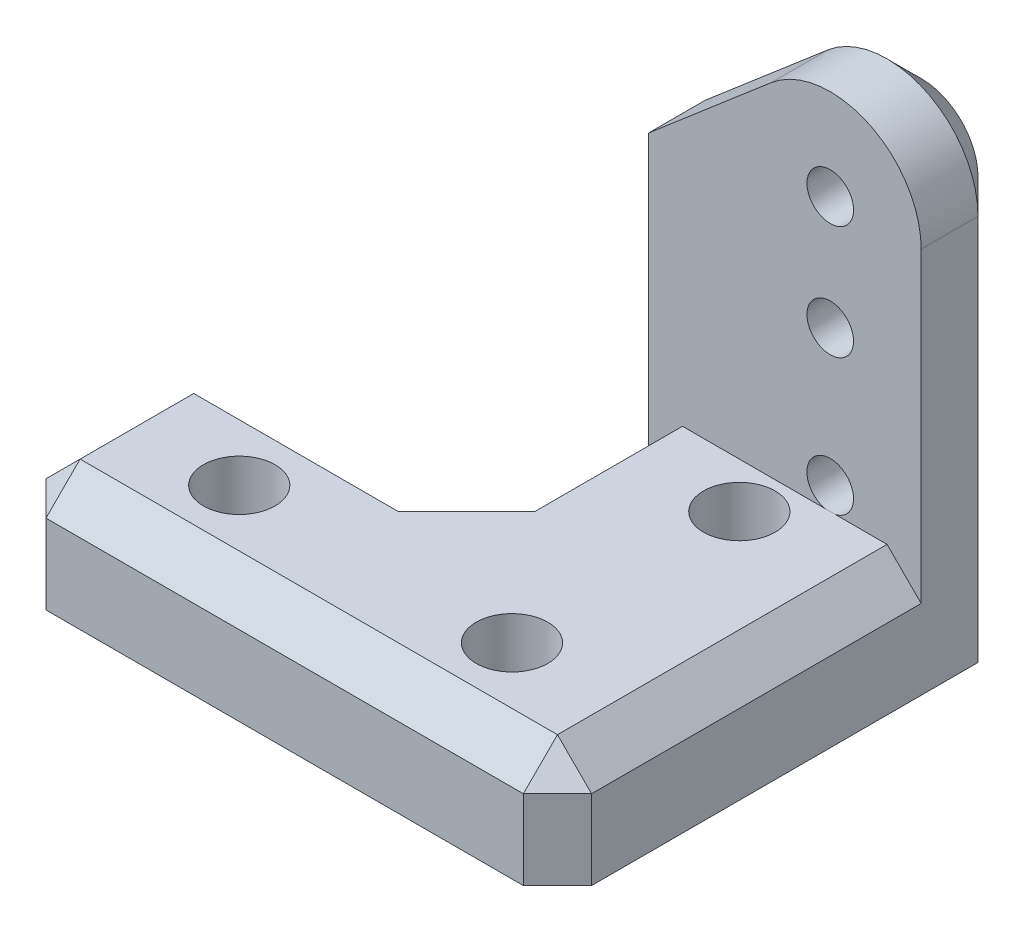
ISO-10303-21;
HEADER;
FILE_DESCRIPTION(('STEP AP214'),'2;1');
FILE_NAME('part.step','',(''),(''),'','','');
FILE_SCHEMA(('AUTOMOTIVE_DESIGN { 1 0 10303 214 1 1 1 1 }'));
ENDSEC;
DATA;
#1=APPLICATION_CONTEXT('core data for automotive mechanical design processes');
#2=APPLICATION_PROTOCOL_DEFINITION('international standard','automotive_design',2000,#1);
#3=PRODUCT_CONTEXT('',#1,'mechanical');
#4=PRODUCT('Part','Part','',(#3));
#5=PRODUCT_RELATED_PRODUCT_CATEGORY('part','',(#4));
#6=PRODUCT_DEFINITION_FORMATION('','',#4);
#7=PRODUCT_DEFINITION_CONTEXT('part definition',#1,'design');
#8=PRODUCT_DEFINITION('design','',#6,#7);
#9=PRODUCT_DEFINITION_SHAPE('','',#8);
#10=(LENGTH_UNIT() NAMED_UNIT(*) SI_UNIT(.MILLI.,.METRE.));
#11=(NAMED_UNIT(*) PLANE_ANGLE_UNIT() SI_UNIT($,.RADIAN.));
#12=(NAMED_UNIT(*) SI_UNIT($,.STERADIAN.) SOLID_ANGLE_UNIT());
#13=UNCERTAINTY_MEASURE_WITH_UNIT(LENGTH_MEASURE(1.E-05),#10,'distance_accuracy_value','');
#14=(GEOMETRIC_REPRESENTATION_CONTEXT(3) GLOBAL_UNCERTAINTY_ASSIGNED_CONTEXT((#13)) GLOBAL_UNIT_ASSIGNED_CONTEXT((#10,
#11,#12)) REPRESENTATION_CONTEXT('',''));
#15=CARTESIAN_POINT('',(0.,0.,0.));
#16=DIRECTION('',(0.,0.,1.));
#17=DIRECTION('',(1.,0.,0.));
#18=AXIS2_PLACEMENT_3D('',#15,#16,#17);
#19=CARTESIAN_POINT('',(4.,0.,0.));
#20=DIRECTION('',(1.,0.,0.));
#21=DIRECTION('',(0.,0.,-1.));
#22=AXIS2_PLACEMENT_3D('',#19,#20,#21);
#23=PLANE('',#22);
#24=DIRECTION('',(0.,0.,1.));
#25=VECTOR('',#24,1.);
#26=CARTESIAN_POINT('',(4.,0.,0.));
#27=LINE('',#26,#25);
#28=CARTESIAN_POINT('',(4.,0.,1.50000000000001));
#29=VERTEX_POINT('',#28);
#30=CARTESIAN_POINT('',(4.,0.,10.5));
#31=VERTEX_POINT('',#30);
#32=EDGE_CURVE('E378',#29,#31,#27,.T.);
#33=ORIENTED_EDGE('',*,*,#32,.T.);
#34=DIRECTION('',(0.,1.,0.));
#35=VECTOR('',#34,1.);
#36=CARTESIAN_POINT('',(4.,5.,10.5));
#37=LINE('',#36,#35);
#38=CARTESIAN_POINT('',(4.,3.49999999999999,10.5));
#39=VERTEX_POINT('',#38);
#40=EDGE_CURVE('E268',#31,#39,#37,.T.);
#41=ORIENTED_EDGE('',*,*,#40,.T.);
#42=DIRECTION('',(0.,0.,-1.));
#43=VECTOR('',#42,1.);
#44=CARTESIAN_POINT('',(4.,3.49999999999999,0.));
#45=LINE('',#44,#43);
#46=CARTESIAN_POINT('',(4.,3.49999999999999,4.));
#47=VERTEX_POINT('',#46);
#48=EDGE_CURVE('E265',#39,#47,#45,.T.);
#49=ORIENTED_EDGE('',*,*,#48,.T.);
#50=DIRECTION('',(0.,-1.,0.));
#51=VECTOR('',#50,1.);
#52=CARTESIAN_POINT('',(4.,5.,4.));
#53=LINE('',#52,#51);
#54=CARTESIAN_POINT('',(4.,15.4211646096066,4.));
#55=VERTEX_POINT('',#54);
#56=EDGE_CURVE('E381',#55,#47,#53,.T.);
#57=ORIENTED_EDGE('',*,*,#56,.F.);
#58=DIRECTION('',(0.,0.,1.));
#59=VECTOR('',#58,1.);
#60=CARTESIAN_POINT('',(4.,15.4211646096066,0.));
#61=LINE('',#60,#59);
#62=CARTESIAN_POINT('',(4.,15.4211646096066,1.50000000000001));
#63=VERTEX_POINT('',#62);
#64=EDGE_CURVE('E379',#63,#55,#61,.T.);
#65=ORIENTED_EDGE('',*,*,#64,.F.);
#66=DIRECTION('',(0.,-1.,0.));
#67=VECTOR('',#66,1.);
#68=CARTESIAN_POINT('',(4.,0.,1.50000000000001));
#69=LINE('',#68,#67);
#70=EDGE_CURVE('E235',#63,#29,#69,.T.);
#71=ORIENTED_EDGE('',*,*,#70,.T.);
#72=EDGE_LOOP('',(#33,#41,#49,#57,#65,#71));
#73=FACE_BOUND('',#72,.T.);
#74=ADVANCED_FACE('F45',(#73),#23,.F.);
#75=CARTESIAN_POINT('',(16.,0.,20.));
#76=DIRECTION('',(0.,1.,0.));
#77=DIRECTION('',(0.,0.,1.));
#78=AXIS2_PLACEMENT_3D('',#75,#76,#77);
#79=PLANE('',#78);
#80=CARTESIAN_POINT('',(10.,0.,6.));
#81=DIRECTION('',(0.,-1.,0.));
#82=DIRECTION('',(0.,0.,-1.));
#83=AXIS2_PLACEMENT_3D('',#80,#81,#82);
#84=CIRCLE('',#83,1.57499999999999);
#85=CARTESIAN_POINT('',(10.,0.,4.42500000000001));
#86=VERTEX_POINT('',#85);
#87=EDGE_CURVE('E357',#86,#86,#84,.T.);
#88=ORIENTED_EDGE('',*,*,#87,.F.);
#89=EDGE_LOOP('',(#88));
#90=FACE_BOUND('',#89,.T.);
#91=CARTESIAN_POINT('',(10.,0.,16.));
#92=DIRECTION('',(0.,-1.,0.));
#93=DIRECTION('',(0.,0.,-1.));
#94=AXIS2_PLACEMENT_3D('',#91,#92,#93);
#95=CIRCLE('',#94,1.57499999999999);
#96=CARTESIAN_POINT('',(10.,0.,14.425));
#97=VERTEX_POINT('',#96);
#98=EDGE_CURVE('E354',#97,#97,#95,.T.);
#99=ORIENTED_EDGE('',*,*,#98,.F.);
#100=EDGE_LOOP('',(#99));
#101=FACE_BOUND('',#100,.T.);
#102=CARTESIAN_POINT('',(-2.,0.,16.));
#103=DIRECTION('',(0.,-1.,0.));
#104=DIRECTION('',(0.,0.,-1.));
#105=AXIS2_PLACEMENT_3D('',#102,#103,#104);
#106=CIRCLE('',#105,1.57499999999999);
#107=CARTESIAN_POINT('',(-2.,0.,14.425));
#108=VERTEX_POINT('',#107);
#109=EDGE_CURVE('E351',#108,#108,#106,.T.);
#110=ORIENTED_EDGE('',*,*,#109,.F.);
#111=EDGE_LOOP('',(#110));
#112=FACE_BOUND('',#111,.T.);
#113=DIRECTION('',(0.,0.,1.));
#114=VECTOR('',#113,1.);
#115=CARTESIAN_POINT('',(-8.,0.,12.));
#116=LINE('',#115,#114);
#117=CARTESIAN_POINT('',(-8.,0.,13.5));
#118=VERTEX_POINT('',#117);
#119=CARTESIAN_POINT('',(-8.,0.,18.5));
#120=VERTEX_POINT('',#119);
#121=EDGE_CURVE('E258',#118,#120,#116,.T.);
#122=ORIENTED_EDGE('',*,*,#121,.F.);
#123=DIRECTION('',(0.707106781186548,0.,-0.707106781186547));
#124=VECTOR('',#123,1.);
#125=CARTESIAN_POINT('',(-8.,0.,13.5));
#126=LINE('',#125,#124);
#127=CARTESIAN_POINT('',(-6.49999999999999,0.,12.));
#128=VERTEX_POINT('',#127);
#129=EDGE_CURVE('E280',#118,#128,#126,.T.);
#130=ORIENTED_EDGE('',*,*,#129,.T.);
#131=DIRECTION('',(1.,0.,0.));
#132=VECTOR('',#131,1.);
#133=CARTESIAN_POINT('',(-8.,0.,12.));
#134=LINE('',#133,#132);
#135=CARTESIAN_POINT('',(2.5,0.,12.));
#136=VERTEX_POINT('',#135);
#137=EDGE_CURVE('E375',#128,#136,#134,.T.);
#138=ORIENTED_EDGE('',*,*,#137,.T.);
#139=DIRECTION('',(-0.707106781186547,0.,0.707106781186548));
#140=VECTOR('',#139,1.);
#141=CARTESIAN_POINT('',(5.24999999999998,0.,9.25000000000001));
#142=LINE('',#141,#140);
#143=EDGE_CURVE('E307',#136,#31,#142,.F.);
#144=ORIENTED_EDGE('',*,*,#143,.T.);
#145=ORIENTED_EDGE('',*,*,#32,.F.);
#146=DIRECTION('',(0.707106781186548,0.,-0.707106781186547));
#147=VECTOR('',#146,1.);
#148=CARTESIAN_POINT('',(5.50000000000001,0.,0.));
#149=LINE('',#148,#147);
#150=CARTESIAN_POINT('',(5.50000000000001,0.,0.));
#151=VERTEX_POINT('',#150);
#152=EDGE_CURVE('E240',#29,#151,#149,.T.);
#153=ORIENTED_EDGE('',*,*,#152,.T.);
#154=DIRECTION('',(1.,0.,0.));
#155=VECTOR('',#154,1.);
#156=CARTESIAN_POINT('',(16.,0.,0.));
#157=LINE('',#156,#155);
#158=CARTESIAN_POINT('',(14.5,0.,0.));
#159=VERTEX_POINT('',#158);
#160=EDGE_CURVE('E212',#151,#159,#157,.T.);
#161=ORIENTED_EDGE('',*,*,#160,.T.);
#162=DIRECTION('',(0.707106781186548,0.,0.707106781186547));
#163=VECTOR('',#162,1.);
#164=CARTESIAN_POINT('',(16.,0.,1.50000000000001));
#165=LINE('',#164,#163);
#166=CARTESIAN_POINT('',(16.,0.,1.50000000000001));
#167=VERTEX_POINT('',#166);
#168=EDGE_CURVE('E237',#159,#167,#165,.T.);
#169=ORIENTED_EDGE('',*,*,#168,.T.);
#170=DIRECTION('',(0.,0.,-1.));
#171=VECTOR('',#170,1.);
#172=CARTESIAN_POINT('',(16.,0.,20.));
#173=LINE('',#172,#171);
#174=CARTESIAN_POINT('',(16.,0.,18.5));
#175=VERTEX_POINT('',#174);
#176=EDGE_CURVE('E224',#175,#167,#173,.T.);
#177=ORIENTED_EDGE('',*,*,#176,.F.);
#178=DIRECTION('',(0.707106781186547,0.,-0.707106781186548));
#179=VECTOR('',#178,1.);
#180=CARTESIAN_POINT('',(14.5,0.,20.));
#181=LINE('',#180,#179);
#182=CARTESIAN_POINT('',(14.5,0.,20.));
#183=VERTEX_POINT('',#182);
#184=EDGE_CURVE('E276',#175,#183,#181,.F.);
#185=ORIENTED_EDGE('',*,*,#184,.T.);
#186=DIRECTION('',(1.,0.,0.));
#187=VECTOR('',#186,1.);
#188=CARTESIAN_POINT('',(16.,0.,20.));
#189=LINE('',#188,#187);
#190=CARTESIAN_POINT('',(-6.49999999999999,0.,20.));
#191=VERTEX_POINT('',#190);
#192=EDGE_CURVE('E213',#191,#183,#189,.T.);
#193=ORIENTED_EDGE('',*,*,#192,.F.);
#194=DIRECTION('',(-0.707106781186548,0.,-0.707106781186547));
#195=VECTOR('',#194,1.);
#196=CARTESIAN_POINT('',(-8.,0.,18.5));
#197=LINE('',#196,#195);
#198=EDGE_CURVE('E278',#191,#120,#197,.T.);
#199=ORIENTED_EDGE('',*,*,#198,.T.);
#200=EDGE_LOOP('',(#122,#130,#138,#144,#145,#153,#161,#169,#177,#185,#193,#199));
#201=FACE_BOUND('',#200,.T.);
#202=ADVANCED_FACE('F413',(#90,#101,#112,#201),#79,.F.);
#203=CARTESIAN_POINT('',(16.,17.,20.));
#204=DIRECTION('',(-1.,0.,0.));
#205=DIRECTION('',(0.,0.,1.));
#206=AXIS2_PLACEMENT_3D('',#203,#204,#205);
#207=PLANE('',#206);
#208=DIRECTION('',(0.,-1.,0.));
#209=VECTOR('',#208,1.);
#210=CARTESIAN_POINT('',(16.,5.,4.));
#211=LINE('',#210,#209);
#212=CARTESIAN_POINT('',(16.,17.,4.));
#213=VERTEX_POINT('',#212);
#214=CARTESIAN_POINT('',(16.,3.49999999999999,4.));
#215=VERTEX_POINT('',#214);
#216=EDGE_CURVE('E201',#213,#215,#211,.T.);
#217=ORIENTED_EDGE('',*,*,#216,.T.);
#218=DIRECTION('',(0.,0.,1.));
#219=VECTOR('',#218,1.);
#220=CARTESIAN_POINT('',(16.,3.49999999999999,20.));
#221=LINE('',#220,#219);
#222=CARTESIAN_POINT('',(16.,3.49999999999999,18.5));
#223=VERTEX_POINT('',#222);
#224=EDGE_CURVE('E290',#215,#223,#221,.T.);
#225=ORIENTED_EDGE('',*,*,#224,.T.);
#226=DIRECTION('',(0.,-1.,0.));
#227=VECTOR('',#226,1.);
#228=CARTESIAN_POINT('',(16.,17.,18.5));
#229=LINE('',#228,#227);
#230=EDGE_CURVE('E288',#223,#175,#229,.T.);
#231=ORIENTED_EDGE('',*,*,#230,.T.);
#232=ORIENTED_EDGE('',*,*,#176,.T.);
#233=DIRECTION('',(0.,1.,0.));
#234=VECTOR('',#233,1.);
#235=CARTESIAN_POINT('',(16.,17.,1.50000000000001));
#236=LINE('',#235,#234);
#237=CARTESIAN_POINT('',(16.,17.,1.50000000000001));
#238=VERTEX_POINT('',#237);
#239=EDGE_CURVE('E246',#167,#238,#236,.T.);
#240=ORIENTED_EDGE('',*,*,#239,.T.);
#241=DIRECTION('',(0.,0.,-1.));
#242=VECTOR('',#241,1.);
#243=CARTESIAN_POINT('',(16.,17.,20.));
#244=LINE('',#243,#242);
#245=EDGE_CURVE('E221',#213,#238,#244,.T.);
#246=ORIENTED_EDGE('',*,*,#245,.F.);
#247=EDGE_LOOP('',(#217,#225,#231,#232,#240,#246));
#248=FACE_BOUND('',#247,.T.);
#249=ADVANCED_FACE('F394',(#248),#207,.F.);
#250=CARTESIAN_POINT('',(12.,17.,20.));
#251=DIRECTION('',(0.,0.,-1.));
#252=DIRECTION('',(-1.,0.,0.));
#253=AXIS2_PLACEMENT_3D('',#250,#251,#252);
#254=CYLINDRICAL_SURFACE('',#253,4.);
#255=ORIENTED_EDGE('',*,*,#245,.T.);
#256=CARTESIAN_POINT('',(12.,17.,1.50000000000001));
#257=DIRECTION('',(0.,0.,-1.));
#258=DIRECTION('',(-1.,0.,0.));
#259=AXIS2_PLACEMENT_3D('',#256,#257,#258);
#260=CIRCLE('',#259,4.);
#261=CARTESIAN_POINT('',(9.40008084297598,20.0398059768577,1.50000000000001));
#262=VERTEX_POINT('',#261);
#263=EDGE_CURVE('E244',#238,#262,#260,.F.);
#264=ORIENTED_EDGE('',*,*,#263,.T.);
#265=DIRECTION('',(0.,0.,-1.));
#266=VECTOR('',#265,1.);
#267=CARTESIAN_POINT('',(9.40008084297598,20.0398059768577,20.));
#268=LINE('',#267,#266);
#269=CARTESIAN_POINT('',(9.40008084297598,20.0398059768577,4.));
#270=VERTEX_POINT('',#269);
#271=EDGE_CURVE('E216',#270,#262,#268,.T.);
#272=ORIENTED_EDGE('',*,*,#271,.F.);
#273=CARTESIAN_POINT('',(12.,17.,4.));
#274=DIRECTION('',(0.,0.,-1.));
#275=DIRECTION('',(-1.,0.,0.));
#276=AXIS2_PLACEMENT_3D('',#273,#274,#275);
#277=CIRCLE('',#276,4.);
#278=EDGE_CURVE('E210',#270,#213,#277,.T.);
#279=ORIENTED_EDGE('',*,*,#278,.T.);
#280=EDGE_LOOP('',(#255,#264,#272,#279));
#281=FACE_BOUND('',#280,.T.);
#282=ADVANCED_FACE('F424',(#281),#254,.T.);
#283=CARTESIAN_POINT('',(0.,12.,20.));
#284=DIRECTION('',(0.649979789256005,-0.759951494214413,0.));
#285=DIRECTION('',(0.759951494214413,0.649979789256005,0.));
#286=AXIS2_PLACEMENT_3D('',#283,#284,#285);
#287=PLANE('',#286);
#288=ORIENTED_EDGE('',*,*,#271,.T.);
#289=DIRECTION('',(-0.759951494214413,-0.649979789256005,0.));
#290=VECTOR('',#289,1.);
#291=CARTESIAN_POINT('',(4.,15.4211646096066,1.50000000000001));
#292=LINE('',#291,#290);
#293=EDGE_CURVE('E242',#262,#63,#292,.T.);
#294=ORIENTED_EDGE('',*,*,#293,.T.);
#295=ORIENTED_EDGE('',*,*,#64,.T.);
#296=DIRECTION('',(0.759951494214413,0.649979789256005,0.));
#297=VECTOR('',#296,1.);
#298=CARTESIAN_POINT('',(0.,12.,4.));
#299=LINE('',#298,#297);
#300=EDGE_CURVE('E205',#55,#270,#299,.T.);
#301=ORIENTED_EDGE('',*,*,#300,.T.);
#302=EDGE_LOOP('',(#288,#294,#295,#301));
#303=FACE_BOUND('',#302,.T.);
#304=ADVANCED_FACE('F429',(#303),#287,.F.);
#305=CARTESIAN_POINT('',(12.,17.,20.));
#306=DIRECTION('',(0.,0.,-1.));
#307=DIRECTION('',(-1.,0.,0.));
#308=AXIS2_PLACEMENT_3D('',#305,#306,#307);
#309=PLANE('',#308);
#310=DIRECTION('',(-1.,0.,0.));
#311=VECTOR('',#310,1.);
#312=CARTESIAN_POINT('',(12.,3.49999999999999,20.));
#313=LINE('',#312,#311);
#314=CARTESIAN_POINT('',(14.5,3.49999999999999,20.));
#315=VERTEX_POINT('',#314);
#316=CARTESIAN_POINT('',(-6.49999999999999,3.49999999999999,20.));
#317=VERTEX_POINT('',#316);
#318=EDGE_CURVE('E282',#315,#317,#313,.T.);
#319=ORIENTED_EDGE('',*,*,#318,.T.);
#320=DIRECTION('',(0.,-1.,0.));
#321=VECTOR('',#320,1.);
#322=CARTESIAN_POINT('',(-6.49999999999999,0.,20.));
#323=LINE('',#322,#321);
#324=EDGE_CURVE('E286',#317,#191,#323,.T.);
#325=ORIENTED_EDGE('',*,*,#324,.T.);
#326=ORIENTED_EDGE('',*,*,#192,.T.);
#327=DIRECTION('',(0.,1.,0.));
#328=VECTOR('',#327,1.);
#329=CARTESIAN_POINT('',(14.5,17.,20.));
#330=LINE('',#329,#328);
#331=EDGE_CURVE('E284',#183,#315,#330,.T.);
#332=ORIENTED_EDGE('',*,*,#331,.T.);
#333=EDGE_LOOP('',(#319,#325,#326,#332));
#334=FACE_BOUND('',#333,.T.);
#335=ADVANCED_FACE('F479',(#334),#309,.F.);
#336=CARTESIAN_POINT('',(12.,17.,0.));
#337=DIRECTION('',(0.,0.,-1.));
#338=DIRECTION('',(-1.,0.,0.));
#339=AXIS2_PLACEMENT_3D('',#336,#337,#338);
#340=PLANE('',#339);
#341=CARTESIAN_POINT('',(12.,6.,0.));
#342=DIRECTION('',(0.,0.,-1.));
#343=DIRECTION('',(-1.,0.,0.));
#344=AXIS2_PLACEMENT_3D('',#341,#342,#343);
#345=CIRCLE('',#344,1.02499999999999);
#346=CARTESIAN_POINT('',(10.975,6.,0.));
#347=VERTEX_POINT('',#346);
#348=EDGE_CURVE('E194',#347,#347,#345,.T.);
#349=ORIENTED_EDGE('',*,*,#348,.F.);
#350=EDGE_LOOP('',(#349));
#351=FACE_BOUND('',#350,.T.);
#352=CARTESIAN_POINT('',(12.,12.,0.));
#353=DIRECTION('',(0.,0.,-1.));
#354=DIRECTION('',(-1.,0.,0.));
#355=AXIS2_PLACEMENT_3D('',#352,#353,#354);
#356=CIRCLE('',#355,1.02499999999999);
#357=CARTESIAN_POINT('',(10.975,12.,0.));
#358=VERTEX_POINT('',#357);
#359=EDGE_CURVE('E193',#358,#358,#356,.T.);
#360=ORIENTED_EDGE('',*,*,#359,.F.);
#361=EDGE_LOOP('',(#360));
#362=FACE_BOUND('',#361,.T.);
#363=ORIENTED_EDGE('',*,*,#160,.F.);
#364=DIRECTION('',(0.,1.,0.));
#365=VECTOR('',#364,1.);
#366=CARTESIAN_POINT('',(5.50000000000001,15.4211646096066,0.));
#367=LINE('',#366,#365);
#368=CARTESIAN_POINT('',(5.50000000000001,14.7302911524017,0.));
#369=VERTEX_POINT('',#368);
#370=EDGE_CURVE('E232',#151,#369,#367,.T.);
#371=ORIENTED_EDGE('',*,*,#370,.T.);
#372=DIRECTION('',(0.759951494214413,0.649979789256005,0.));
#373=VECTOR('',#372,1.);
#374=CARTESIAN_POINT('',(10.37505052686,18.899878735536,0.));
#375=LINE('',#374,#373);
#376=CARTESIAN_POINT('',(10.37505052686,18.899878735536,0.));
#377=VERTEX_POINT('',#376);
#378=EDGE_CURVE('E230',#369,#377,#375,.T.);
#379=ORIENTED_EDGE('',*,*,#378,.T.);
#380=CARTESIAN_POINT('',(12.,17.,0.));
#381=DIRECTION('',(0.,0.,-1.));
#382=DIRECTION('',(-1.,0.,0.));
#383=AXIS2_PLACEMENT_3D('',#380,#381,#382);
#384=CIRCLE('',#383,2.49999999999999);
#385=CARTESIAN_POINT('',(14.5,17.,0.));
#386=VERTEX_POINT('',#385);
#387=EDGE_CURVE('E228',#377,#386,#384,.T.);
#388=ORIENTED_EDGE('',*,*,#387,.T.);
#389=DIRECTION('',(0.,-1.,0.));
#390=VECTOR('',#389,1.);
#391=CARTESIAN_POINT('',(14.5,0.,0.));
#392=LINE('',#391,#390);
#393=EDGE_CURVE('E226',#386,#159,#392,.T.);
#394=ORIENTED_EDGE('',*,*,#393,.T.);
#395=EDGE_LOOP('',(#363,#371,#379,#388,#394));
#396=FACE_BOUND('',#395,.T.);
#397=CARTESIAN_POINT('',(12.,17.,0.));
#398=DIRECTION('',(0.,0.,-1.));
#399=DIRECTION('',(-1.,0.,0.));
#400=AXIS2_PLACEMENT_3D('',#397,#398,#399);
#401=CIRCLE('',#400,1.025);
#402=CARTESIAN_POINT('',(10.975,17.,0.));
#403=VERTEX_POINT('',#402);
#404=EDGE_CURVE('E387',#403,#403,#401,.T.);
#405=ORIENTED_EDGE('',*,*,#404,.F.);
#406=EDGE_LOOP('',(#405));
#407=FACE_BOUND('',#406,.T.);
#408=ADVANCED_FACE('F481',(#351,#362,#396,#407),#340,.T.);
#409=CARTESIAN_POINT('',(16.,5.,4.));
#410=DIRECTION('',(0.,0.,-1.));
#411=DIRECTION('',(-1.,0.,0.));
#412=AXIS2_PLACEMENT_3D('',#409,#410,#411);
#413=PLANE('',#412);
#414=CARTESIAN_POINT('',(12.,12.,4.));
#415=DIRECTION('',(0.,0.,-1.));
#416=DIRECTION('',(-1.,0.,0.));
#417=AXIS2_PLACEMENT_3D('',#414,#415,#416);
#418=CIRCLE('',#417,1.02499999999999);
#419=CARTESIAN_POINT('',(10.975,12.,4.));
#420=VERTEX_POINT('',#419);
#421=EDGE_CURVE('E363',#420,#420,#418,.T.);
#422=ORIENTED_EDGE('',*,*,#421,.T.);
#423=EDGE_LOOP('',(#422));
#424=FACE_BOUND('',#423,.T.);
#425=CARTESIAN_POINT('',(12.,17.,4.));
#426=DIRECTION('',(0.,0.,1.));
#427=DIRECTION('',(1.,0.,0.));
#428=AXIS2_PLACEMENT_3D('',#425,#426,#427);
#429=CIRCLE('',#428,1.025);
#430=CARTESIAN_POINT('',(13.025,17.,4.));
#431=VERTEX_POINT('',#430);
#432=EDGE_CURVE('E385',#431,#431,#429,.T.);
#433=ORIENTED_EDGE('',*,*,#432,.F.);
#434=EDGE_LOOP('',(#433));
#435=FACE_BOUND('',#434,.T.);
#436=DIRECTION('',(-1.,0.,0.));
#437=VECTOR('',#436,1.);
#438=CARTESIAN_POINT('',(16.,5.,4.));
#439=LINE('',#438,#437);
#440=CARTESIAN_POINT('',(11.775,5.,4.));
#441=VERTEX_POINT('',#440);
#442=CARTESIAN_POINT('',(5.50000000000001,5.,4.));
#443=VERTEX_POINT('',#442);
#444=EDGE_CURVE('E197',#441,#443,#439,.T.);
#445=ORIENTED_EDGE('',*,*,#444,.F.);
#446=CARTESIAN_POINT('',(12.,6.,4.));
#447=DIRECTION('',(0.,0.,-1.));
#448=DIRECTION('',(-1.,0.,0.));
#449=AXIS2_PLACEMENT_3D('',#446,#447,#448);
#450=CIRCLE('',#449,1.02499999999999);
#451=CARTESIAN_POINT('',(12.225,5.,4.));
#452=VERTEX_POINT('',#451);
#453=EDGE_CURVE('E11',#441,#452,#450,.T.);
#454=ORIENTED_EDGE('',*,*,#453,.T.);
#455=CARTESIAN_POINT('',(14.5,5.,4.));
#456=VERTEX_POINT('',#455);
#457=EDGE_CURVE('E203',#456,#452,#439,.T.);
#458=ORIENTED_EDGE('',*,*,#457,.F.);
#459=DIRECTION('',(-0.707106781186547,0.707106781186548,0.));
#460=VECTOR('',#459,1.);
#461=CARTESIAN_POINT('',(15.25,4.25,4.));
#462=LINE('',#461,#460);
#463=EDGE_CURVE('E309',#456,#215,#462,.F.);
#464=ORIENTED_EDGE('',*,*,#463,.T.);
#465=ORIENTED_EDGE('',*,*,#216,.F.);
#466=ORIENTED_EDGE('',*,*,#278,.F.);
#467=ORIENTED_EDGE('',*,*,#300,.F.);
#468=ORIENTED_EDGE('',*,*,#56,.T.);
#469=DIRECTION('',(-0.707106781186547,-0.707106781186548,0.));
#470=VECTOR('',#469,1.);
#471=CARTESIAN_POINT('',(10.75,10.25,4.));
#472=LINE('',#471,#470);
#473=EDGE_CURVE('E54',#47,#443,#472,.F.);
#474=ORIENTED_EDGE('',*,*,#473,.T.);
#475=EDGE_LOOP('',(#445,#454,#458,#464,#465,#466,#467,#468,#474));
#476=FACE_BOUND('',#475,.T.);
#477=ADVANCED_FACE('F198',(#424,#435,#476),#413,.F.);
#478=CARTESIAN_POINT('',(16.,5.,20.));
#479=DIRECTION('',(0.,-1.,0.));
#480=DIRECTION('',(0.,0.,-1.));
#481=AXIS2_PLACEMENT_3D('',#478,#479,#480);
#482=PLANE('',#481);
#483=CARTESIAN_POINT('',(10.,5.,6.));
#484=DIRECTION('',(0.,-1.,0.));
#485=DIRECTION('',(0.,0.,-1.));
#486=AXIS2_PLACEMENT_3D('',#483,#484,#485);
#487=CIRCLE('',#486,1.57499999999999);
#488=CARTESIAN_POINT('',(10.,5.,4.42500000000001));
#489=VERTEX_POINT('',#488);
#490=EDGE_CURVE('E355',#489,#489,#487,.T.);
#491=ORIENTED_EDGE('',*,*,#490,.T.);
#492=EDGE_LOOP('',(#491));
#493=FACE_BOUND('',#492,.T.);
#494=CARTESIAN_POINT('',(10.,5.,16.));
#495=DIRECTION('',(0.,-1.,0.));
#496=DIRECTION('',(0.,0.,-1.));
#497=AXIS2_PLACEMENT_3D('',#494,#495,#496);
#498=CIRCLE('',#497,1.57499999999999);
#499=CARTESIAN_POINT('',(10.,5.,14.425));
#500=VERTEX_POINT('',#499);
#501=EDGE_CURVE('E352',#500,#500,#498,.T.);
#502=ORIENTED_EDGE('',*,*,#501,.T.);
#503=EDGE_LOOP('',(#502));
#504=FACE_BOUND('',#503,.T.);
#505=CARTESIAN_POINT('',(-2.,5.,16.));
#506=DIRECTION('',(0.,-1.,0.));
#507=DIRECTION('',(0.,0.,-1.));
#508=AXIS2_PLACEMENT_3D('',#505,#506,#507);
#509=CIRCLE('',#508,1.57499999999999);
#510=CARTESIAN_POINT('',(-2.,5.,14.425));
#511=VERTEX_POINT('',#510);
#512=EDGE_CURVE('E317',#511,#511,#509,.T.);
#513=ORIENTED_EDGE('',*,*,#512,.T.);
#514=EDGE_LOOP('',(#513));
#515=FACE_BOUND('',#514,.T.);
#516=DIRECTION('',(1.,0.,0.));
#517=VECTOR('',#516,1.);
#518=CARTESIAN_POINT('',(16.,5.,18.5));
#519=LINE('',#518,#517);
#520=CARTESIAN_POINT('',(-6.5,5.,18.5));
#521=VERTEX_POINT('',#520);
#522=CARTESIAN_POINT('',(14.5,5.,18.5));
#523=VERTEX_POINT('',#522);
#524=EDGE_CURVE('E68',#521,#523,#519,.T.);
#525=ORIENTED_EDGE('',*,*,#524,.T.);
#526=DIRECTION('',(0.,0.,-1.));
#527=VECTOR('',#526,1.);
#528=CARTESIAN_POINT('',(14.5,5.,20.));
#529=LINE('',#528,#527);
#530=EDGE_CURVE('E305',#523,#456,#529,.T.);
#531=ORIENTED_EDGE('',*,*,#530,.T.);
#532=ORIENTED_EDGE('',*,*,#457,.T.);
#533=EDGE_CURVE('E192',#452,#441,#439,.T.);
#534=ORIENTED_EDGE('',*,*,#533,.T.);
#535=ORIENTED_EDGE('',*,*,#444,.T.);
#536=DIRECTION('',(0.,0.,1.));
#537=VECTOR('',#536,1.);
#538=CARTESIAN_POINT('',(5.50000000000001,5.,20.));
#539=LINE('',#538,#537);
#540=CARTESIAN_POINT('',(5.50000000000001,5.,10.5));
#541=VERTEX_POINT('',#540);
#542=EDGE_CURVE('E298',#443,#541,#539,.T.);
#543=ORIENTED_EDGE('',*,*,#542,.T.);
#544=DIRECTION('',(0.707106781186547,0.,-0.707106781186548));
#545=VECTOR('',#544,1.);
#546=CARTESIAN_POINT('',(5.50000000000001,5.,10.5));
#547=LINE('',#546,#545);
#548=CARTESIAN_POINT('',(4.,5.,12.));
#549=VERTEX_POINT('',#548);
#550=EDGE_CURVE('E292',#549,#541,#547,.T.);
#551=ORIENTED_EDGE('',*,*,#550,.F.);
#552=DIRECTION('',(0.707106781186547,0.,-0.707106781186548));
#553=VECTOR('',#552,1.);
#554=CARTESIAN_POINT('',(5.50000000000001,5.,10.5));
#555=LINE('',#554,#553);
#556=CARTESIAN_POINT('',(2.5,5.,13.5));
#557=VERTEX_POINT('',#556);
#558=EDGE_CURVE('E295',#557,#549,#555,.T.);
#559=ORIENTED_EDGE('',*,*,#558,.F.);
#560=DIRECTION('',(-1.,0.,0.));
#561=VECTOR('',#560,1.);
#562=CARTESIAN_POINT('',(16.,5.,13.5));
#563=LINE('',#562,#561);
#564=CARTESIAN_POINT('',(-6.5,5.,13.5));
#565=VERTEX_POINT('',#564);
#566=EDGE_CURVE('E300',#557,#565,#563,.T.);
#567=ORIENTED_EDGE('',*,*,#566,.T.);
#568=DIRECTION('',(0.,0.,1.));
#569=VECTOR('',#568,1.);
#570=CARTESIAN_POINT('',(-6.5,5.,20.));
#571=LINE('',#570,#569);
#572=EDGE_CURVE('E302',#565,#521,#571,.T.);
#573=ORIENTED_EDGE('',*,*,#572,.T.);
#574=EDGE_LOOP('',(#525,#531,#532,#534,#535,#543,#551,#559,#567,#573));
#575=FACE_BOUND('',#574,.T.);
#576=ADVANCED_FACE('F204',(#493,#504,#515,#575),#482,.F.);
#577=CARTESIAN_POINT('',(12.,17.,4.));
#578=DIRECTION('',(0.,0.,1.));
#579=DIRECTION('',(1.,0.,0.));
#580=AXIS2_PLACEMENT_3D('',#577,#578,#579);
#581=CYLINDRICAL_SURFACE('',#580,1.025);
#582=ORIENTED_EDGE('',*,*,#404,.T.);
#583=EDGE_LOOP('',(#582));
#584=FACE_BOUND('',#583,.T.);
#585=ORIENTED_EDGE('',*,*,#432,.T.);
#586=EDGE_LOOP('',(#585));
#587=FACE_BOUND('',#586,.T.);
#588=ADVANCED_FACE('F502',(#584,#587),#581,.F.);
#589=CARTESIAN_POINT('',(-8.,5.,12.));
#590=DIRECTION('',(0.,0.,1.));
#591=DIRECTION('',(1.,0.,0.));
#592=AXIS2_PLACEMENT_3D('',#589,#590,#591);
#593=PLANE('',#592);
#594=DIRECTION('',(1.,0.,0.));
#595=VECTOR('',#594,1.);
#596=CARTESIAN_POINT('',(-8.,3.49999999999999,12.));
#597=LINE('',#596,#595);
#598=CARTESIAN_POINT('',(-6.49999999999999,3.49999999999999,12.));
#599=VERTEX_POINT('',#598);
#600=CARTESIAN_POINT('',(2.5,3.49999999999999,12.));
#601=VERTEX_POINT('',#600);
#602=EDGE_CURVE('E248',#599,#601,#597,.T.);
#603=ORIENTED_EDGE('',*,*,#602,.T.);
#604=DIRECTION('',(0.,-1.,0.));
#605=VECTOR('',#604,1.);
#606=CARTESIAN_POINT('',(2.5,0.,12.));
#607=LINE('',#606,#605);
#608=EDGE_CURVE('E262',#601,#136,#607,.T.);
#609=ORIENTED_EDGE('',*,*,#608,.T.);
#610=ORIENTED_EDGE('',*,*,#137,.F.);
#611=DIRECTION('',(0.,1.,0.));
#612=VECTOR('',#611,1.);
#613=CARTESIAN_POINT('',(-6.49999999999999,5.,12.));
#614=LINE('',#613,#612);
#615=EDGE_CURVE('E260',#128,#599,#614,.T.);
#616=ORIENTED_EDGE('',*,*,#615,.T.);
#617=EDGE_LOOP('',(#603,#609,#610,#616));
#618=FACE_BOUND('',#617,.T.);
#619=ADVANCED_FACE('F500',(#618),#593,.F.);
#620=CARTESIAN_POINT('',(-8.,0.,0.));
#621=DIRECTION('',(-1.,0.,0.));
#622=DIRECTION('',(0.,0.,1.));
#623=AXIS2_PLACEMENT_3D('',#620,#621,#622);
#624=PLANE('',#623);
#625=DIRECTION('',(0.,0.,-1.));
#626=VECTOR('',#625,1.);
#627=CARTESIAN_POINT('',(-8.,3.49999999999999,12.));
#628=LINE('',#627,#626);
#629=CARTESIAN_POINT('',(-8.,3.49999999999999,18.5));
#630=VERTEX_POINT('',#629);
#631=CARTESIAN_POINT('',(-8.,3.49999999999999,13.5));
#632=VERTEX_POINT('',#631);
#633=EDGE_CURVE('E270',#630,#632,#628,.T.);
#634=ORIENTED_EDGE('',*,*,#633,.T.);
#635=DIRECTION('',(0.,-1.,0.));
#636=VECTOR('',#635,1.);
#637=CARTESIAN_POINT('',(-8.,0.,13.5));
#638=LINE('',#637,#636);
#639=EDGE_CURVE('E274',#632,#118,#638,.T.);
#640=ORIENTED_EDGE('',*,*,#639,.T.);
#641=ORIENTED_EDGE('',*,*,#121,.T.);
#642=DIRECTION('',(0.,1.,0.));
#643=VECTOR('',#642,1.);
#644=CARTESIAN_POINT('',(-8.,5.,18.5));
#645=LINE('',#644,#643);
#646=EDGE_CURVE('E272',#120,#630,#645,.T.);
#647=ORIENTED_EDGE('',*,*,#646,.T.);
#648=EDGE_LOOP('',(#634,#640,#641,#647));
#649=FACE_BOUND('',#648,.T.);
#650=ADVANCED_FACE('F465',(#649),#624,.T.);
#651=CARTESIAN_POINT('',(16.,17.,1.50000000000001));
#652=DIRECTION('',(0.707106781186547,0.,-0.707106781186548));
#653=DIRECTION('',(0.,-1.,0.));
#654=AXIS2_PLACEMENT_3D('',#651,#652,#653);
#655=PLANE('',#654);
#656=ORIENTED_EDGE('',*,*,#168,.F.);
#657=ORIENTED_EDGE('',*,*,#393,.F.);
#658=DIRECTION('',(-0.707106781186548,0.,-0.707106781186547));
#659=VECTOR('',#658,1.);
#660=CARTESIAN_POINT('',(16.,17.,1.50000000000001));
#661=LINE('',#660,#659);
#662=EDGE_CURVE('E255',#238,#386,#661,.T.);
#663=ORIENTED_EDGE('',*,*,#662,.F.);
#664=ORIENTED_EDGE('',*,*,#239,.F.);
#665=EDGE_LOOP('',(#656,#657,#663,#664));
#666=FACE_BOUND('',#665,.T.);
#667=ADVANCED_FACE('F421',(#666),#655,.T.);
#668=CARTESIAN_POINT('',(12.,17.,1.50000000000001));
#669=DIRECTION('',(0.,0.,1.));
#670=DIRECTION('',(1.,0.,0.));
#671=AXIS2_PLACEMENT_3D('',#668,#669,#670);
#672=CONICAL_SURFACE('',#671,4.,0.785398163397449);
#673=ORIENTED_EDGE('',*,*,#662,.T.);
#674=ORIENTED_EDGE('',*,*,#387,.F.);
#675=DIRECTION('',(0.459605116617125,-0.537366854931862,-0.707106781186547));
#676=VECTOR('',#675,1.);
#677=CARTESIAN_POINT('',(9.40008084297598,20.0398059768577,1.50000000000001));
#678=LINE('',#677,#676);
#679=EDGE_CURVE('E251',#262,#377,#678,.T.);
#680=ORIENTED_EDGE('',*,*,#679,.F.);
#681=ORIENTED_EDGE('',*,*,#263,.F.);
#682=EDGE_LOOP('',(#673,#674,#680,#681));
#683=FACE_BOUND('',#682,.T.);
#684=ADVANCED_FACE('F538',(#683),#672,.T.);
#685=CARTESIAN_POINT('',(0.,12.,1.50000000000001));
#686=DIRECTION('',(-0.459605116617124,0.537366854931861,-0.707106781186547));
#687=DIRECTION('',(0.759951494214413,0.649979789256005,0.));
#688=AXIS2_PLACEMENT_3D('',#685,#686,#687);
#689=PLANE('',#688);
#690=ORIENTED_EDGE('',*,*,#679,.T.);
#691=ORIENTED_EDGE('',*,*,#378,.F.);
#692=DIRECTION('',(-0.672347945952809,0.309671566576716,0.672347945952808));
#693=VECTOR('',#692,1.);
#694=CARTESIAN_POINT('',(2.90410352085392,15.9259151357976,2.59589647914609));
#695=LINE('',#694,#693);
#696=EDGE_CURVE('E249',#63,#369,#695,.F.);
#697=ORIENTED_EDGE('',*,*,#696,.F.);
#698=ORIENTED_EDGE('',*,*,#293,.F.);
#699=EDGE_LOOP('',(#690,#691,#697,#698));
#700=FACE_BOUND('',#699,.T.);
#701=ADVANCED_FACE('F535',(#700),#689,.T.);
#702=CARTESIAN_POINT('',(5.50000000000001,17.,0.));
#703=DIRECTION('',(-0.707106781186547,0.,-0.707106781186548));
#704=DIRECTION('',(0.,-1.,0.));
#705=AXIS2_PLACEMENT_3D('',#702,#703,#704);
#706=PLANE('',#705);
#707=ORIENTED_EDGE('',*,*,#152,.F.);
#708=ORIENTED_EDGE('',*,*,#70,.F.);
#709=ORIENTED_EDGE('',*,*,#696,.T.);
#710=ORIENTED_EDGE('',*,*,#370,.F.);
#711=EDGE_LOOP('',(#707,#708,#709,#710));
#712=FACE_BOUND('',#711,.T.);
#713=ADVANCED_FACE('F531',(#712),#706,.T.);
#714=CARTESIAN_POINT('',(16.,3.49999999999999,20.));
#715=DIRECTION('',(-0.707106781186548,-0.707106781186547,0.));
#716=DIRECTION('',(0.,0.,1.));
#717=AXIS2_PLACEMENT_3D('',#714,#715,#716);
#718=PLANE('',#717);
#719=ORIENTED_EDGE('',*,*,#463,.F.);
#720=ORIENTED_EDGE('',*,*,#530,.F.);
#721=DIRECTION('',(0.707106781186547,-0.707106781186548,0.));
#722=VECTOR('',#721,1.);
#723=CARTESIAN_POINT('',(16.,3.49999999999999,18.5));
#724=LINE('',#723,#722);
#725=EDGE_CURVE('E252',#223,#523,#724,.F.);
#726=ORIENTED_EDGE('',*,*,#725,.F.);
#727=ORIENTED_EDGE('',*,*,#224,.F.);
#728=EDGE_LOOP('',(#719,#720,#726,#727));
#729=FACE_BOUND('',#728,.T.);
#730=ADVANCED_FACE('F48',(#729),#718,.F.);
#731=CARTESIAN_POINT('',(14.5,17.,20.));
#732=DIRECTION('',(-0.707106781186548,0.,-0.707106781186547));
#733=DIRECTION('',(0.,1.,0.));
#734=AXIS2_PLACEMENT_3D('',#731,#732,#733);
#735=PLANE('',#734);
#736=ORIENTED_EDGE('',*,*,#184,.F.);
#737=ORIENTED_EDGE('',*,*,#230,.F.);
#738=DIRECTION('',(-0.707106781186547,0.,0.707106781186548));
#739=VECTOR('',#738,1.);
#740=CARTESIAN_POINT('',(16.,3.49999999999999,18.5));
#741=LINE('',#740,#739);
#742=EDGE_CURVE('E344',#315,#223,#741,.F.);
#743=ORIENTED_EDGE('',*,*,#742,.F.);
#744=ORIENTED_EDGE('',*,*,#331,.F.);
#745=EDGE_LOOP('',(#736,#737,#743,#744));
#746=FACE_BOUND('',#745,.T.);
#747=ADVANCED_FACE('F409',(#746),#735,.F.);
#748=CARTESIAN_POINT('',(16.,3.49999999999999,18.5));
#749=DIRECTION('',(0.577350269189627,0.577350269189624,0.577350269189626));
#750=DIRECTION('',(0.707106781186547,0.,-0.707106781186548));
#751=AXIS2_PLACEMENT_3D('',#748,#749,#750);
#752=PLANE('',#751);
#753=ORIENTED_EDGE('',*,*,#742,.T.);
#754=ORIENTED_EDGE('',*,*,#725,.T.);
#755=DIRECTION('',(0.,0.707106781186548,-0.707106781186547));
#756=VECTOR('',#755,1.);
#757=CARTESIAN_POINT('',(14.5,4.25,19.25));
#758=LINE('',#757,#756);
#759=EDGE_CURVE('E341',#315,#523,#758,.T.);
#760=ORIENTED_EDGE('',*,*,#759,.F.);
#761=EDGE_LOOP('',(#753,#754,#760));
#762=FACE_BOUND('',#761,.T.);
#763=ADVANCED_FACE('F404',(#762),#752,.T.);
#764=CARTESIAN_POINT('',(12.,3.49999999999999,20.));
#765=DIRECTION('',(0.,-0.707106781186547,-0.707106781186548));
#766=DIRECTION('',(-1.,0.,0.));
#767=AXIS2_PLACEMENT_3D('',#764,#765,#766);
#768=PLANE('',#767);
#769=ORIENTED_EDGE('',*,*,#759,.T.);
#770=ORIENTED_EDGE('',*,*,#524,.F.);
#771=DIRECTION('',(0.,-0.707106781186548,0.707106781186547));
#772=VECTOR('',#771,1.);
#773=CARTESIAN_POINT('',(-6.49999999999999,4.25,19.25));
#774=LINE('',#773,#772);
#775=EDGE_CURVE('E338',#317,#521,#774,.F.);
#776=ORIENTED_EDGE('',*,*,#775,.F.);
#777=ORIENTED_EDGE('',*,*,#318,.F.);
#778=EDGE_LOOP('',(#769,#770,#776,#777));
#779=FACE_BOUND('',#778,.T.);
#780=ADVANCED_FACE('F477',(#779),#768,.F.);
#781=CARTESIAN_POINT('',(-8.,0.,18.5));
#782=DIRECTION('',(-0.707106781186547,0.,0.707106781186548));
#783=DIRECTION('',(0.,-1.,0.));
#784=AXIS2_PLACEMENT_3D('',#781,#782,#783);
#785=PLANE('',#784);
#786=ORIENTED_EDGE('',*,*,#198,.F.);
#787=ORIENTED_EDGE('',*,*,#324,.F.);
#788=DIRECTION('',(0.707106781186548,0.,0.707106781186547));
#789=VECTOR('',#788,1.);
#790=CARTESIAN_POINT('',(-8.,3.49999999999999,18.5));
#791=LINE('',#790,#789);
#792=EDGE_CURVE('E335',#630,#317,#791,.T.);
#793=ORIENTED_EDGE('',*,*,#792,.F.);
#794=ORIENTED_EDGE('',*,*,#646,.F.);
#795=EDGE_LOOP('',(#786,#787,#793,#794));
#796=FACE_BOUND('',#795,.T.);
#797=ADVANCED_FACE('F471',(#796),#785,.T.);
#798=CARTESIAN_POINT('',(-8.,3.49999999999999,18.5));
#799=DIRECTION('',(-0.577350269189626,0.577350269189624,0.577350269189627));
#800=DIRECTION('',(0.707106781186548,0.,0.707106781186547));
#801=AXIS2_PLACEMENT_3D('',#798,#799,#800);
#802=PLANE('',#801);
#803=ORIENTED_EDGE('',*,*,#792,.T.);
#804=ORIENTED_EDGE('',*,*,#775,.T.);
#805=DIRECTION('',(-0.707106781186547,-0.707106781186548,0.));
#806=VECTOR('',#805,1.);
#807=CARTESIAN_POINT('',(-8.,3.49999999999999,18.5));
#808=LINE('',#807,#806);
#809=EDGE_CURVE('E332',#630,#521,#808,.F.);
#810=ORIENTED_EDGE('',*,*,#809,.F.);
#811=EDGE_LOOP('',(#803,#804,#810));
#812=FACE_BOUND('',#811,.T.);
#813=ADVANCED_FACE('F475',(#812),#802,.T.);
#814=CARTESIAN_POINT('',(-8.,3.49999999999999,0.));
#815=DIRECTION('',(-0.707106781186548,0.707106781186547,0.));
#816=DIRECTION('',(0.,0.,1.));
#817=AXIS2_PLACEMENT_3D('',#814,#815,#816);
#818=PLANE('',#817);
#819=ORIENTED_EDGE('',*,*,#809,.T.);
#820=ORIENTED_EDGE('',*,*,#572,.F.);
#821=DIRECTION('',(0.707106781186547,0.707106781186548,0.));
#822=VECTOR('',#821,1.);
#823=CARTESIAN_POINT('',(-7.25,4.25,13.5));
#824=LINE('',#823,#822);
#825=EDGE_CURVE('E329',#632,#565,#824,.T.);
#826=ORIENTED_EDGE('',*,*,#825,.F.);
#827=ORIENTED_EDGE('',*,*,#633,.F.);
#828=EDGE_LOOP('',(#819,#820,#826,#827));
#829=FACE_BOUND('',#828,.T.);
#830=ADVANCED_FACE('F453',(#829),#818,.T.);
#831=CARTESIAN_POINT('',(-8.,0.,13.5));
#832=DIRECTION('',(-0.707106781186547,0.,-0.707106781186548));
#833=DIRECTION('',(0.,1.,0.));
#834=AXIS2_PLACEMENT_3D('',#831,#832,#833);
#835=PLANE('',#834);
#836=ORIENTED_EDGE('',*,*,#129,.F.);
#837=ORIENTED_EDGE('',*,*,#639,.F.);
#838=DIRECTION('',(-0.707106781186548,0.,0.707106781186547));
#839=VECTOR('',#838,1.);
#840=CARTESIAN_POINT('',(-6.49999999999999,3.49999999999999,12.));
#841=LINE('',#840,#839);
#842=EDGE_CURVE('E326',#599,#632,#841,.T.);
#843=ORIENTED_EDGE('',*,*,#842,.F.);
#844=ORIENTED_EDGE('',*,*,#615,.F.);
#845=EDGE_LOOP('',(#836,#837,#843,#844));
#846=FACE_BOUND('',#845,.T.);
#847=ADVANCED_FACE('F463',(#846),#835,.T.);
#848=CARTESIAN_POINT('',(-6.49999999999999,3.49999999999999,12.));
#849=DIRECTION('',(-0.577350269189626,0.577350269189624,-0.577350269189627));
#850=DIRECTION('',(-0.707106781186548,0.,0.707106781186547));
#851=AXIS2_PLACEMENT_3D('',#848,#849,#850);
#852=PLANE('',#851);
#853=ORIENTED_EDGE('',*,*,#842,.T.);
#854=ORIENTED_EDGE('',*,*,#825,.T.);
#855=DIRECTION('',(0.,0.707106781186548,0.707106781186547));
#856=VECTOR('',#855,1.);
#857=CARTESIAN_POINT('',(-6.49999999999999,3.49999999999999,12.));
#858=LINE('',#857,#856);
#859=EDGE_CURVE('E323',#599,#565,#858,.T.);
#860=ORIENTED_EDGE('',*,*,#859,.F.);
#861=EDGE_LOOP('',(#853,#854,#860));
#862=FACE_BOUND('',#861,.T.);
#863=ADVANCED_FACE('F457',(#862),#852,.T.);
#864=CARTESIAN_POINT('',(5.50000000000001,5.,20.));
#865=DIRECTION('',(0.707106781186548,-0.707106781186547,0.));
#866=DIRECTION('',(0.,0.,1.));
#867=AXIS2_PLACEMENT_3D('',#864,#865,#866);
#868=PLANE('',#867);
#869=ORIENTED_EDGE('',*,*,#473,.F.);
#870=ORIENTED_EDGE('',*,*,#48,.F.);
#871=DIRECTION('',(-0.707106781186547,-0.707106781186548,0.));
#872=VECTOR('',#871,1.);
#873=CARTESIAN_POINT('',(5.50000000000001,5.,10.5));
#874=LINE('',#873,#872);
#875=EDGE_CURVE('E320',#541,#39,#874,.T.);
#876=ORIENTED_EDGE('',*,*,#875,.F.);
#877=ORIENTED_EDGE('',*,*,#542,.F.);
#878=EDGE_LOOP('',(#869,#870,#876,#877));
#879=FACE_BOUND('',#878,.T.);
#880=ADVANCED_FACE('F439',(#879),#868,.F.);
#881=CARTESIAN_POINT('',(-8.,3.49999999999999,12.));
#882=DIRECTION('',(0.,-0.707106781186547,0.707106781186548));
#883=DIRECTION('',(1.,0.,0.));
#884=AXIS2_PLACEMENT_3D('',#881,#882,#883);
#885=PLANE('',#884);
#886=ORIENTED_EDGE('',*,*,#859,.T.);
#887=ORIENTED_EDGE('',*,*,#566,.F.);
#888=DIRECTION('',(0.,0.707106781186548,0.707106781186547));
#889=VECTOR('',#888,1.);
#890=CARTESIAN_POINT('',(2.5,3.49999999999999,12.));
#891=LINE('',#890,#889);
#892=EDGE_CURVE('E316',#601,#557,#891,.T.);
#893=ORIENTED_EDGE('',*,*,#892,.F.);
#894=ORIENTED_EDGE('',*,*,#602,.F.);
#895=EDGE_LOOP('',(#886,#887,#893,#894));
#896=FACE_BOUND('',#895,.T.);
#897=ADVANCED_FACE('F448',(#896),#885,.F.);
#898=CARTESIAN_POINT('',(4.,3.49999999999999,10.5));
#899=DIRECTION('',(-0.577350269189627,0.577350269189625,-0.577350269189626));
#900=DIRECTION('',(-0.707106781186547,0.,0.707106781186548));
#901=AXIS2_PLACEMENT_3D('',#898,#899,#900);
#902=PLANE('',#901);
#903=ORIENTED_EDGE('',*,*,#550,.T.);
#904=ORIENTED_EDGE('',*,*,#875,.T.);
#905=DIRECTION('',(0.707106781186547,0.,-0.707106781186548));
#906=VECTOR('',#905,1.);
#907=CARTESIAN_POINT('',(4.,3.49999999999999,10.5));
#908=LINE('',#907,#906);
#909=EDGE_CURVE('E313',#601,#39,#908,.T.);
#910=ORIENTED_EDGE('',*,*,#909,.F.);
#911=ORIENTED_EDGE('',*,*,#892,.T.);
#912=ORIENTED_EDGE('',*,*,#558,.T.);
#913=EDGE_LOOP('',(#903,#904,#910,#911,#912));
#914=FACE_BOUND('',#913,.T.);
#915=ADVANCED_FACE('F442',(#914),#902,.T.);
#916=CARTESIAN_POINT('',(2.5,5.,12.));
#917=DIRECTION('',(-0.707106781186548,0.,-0.707106781186547));
#918=DIRECTION('',(0.,1.,0.));
#919=AXIS2_PLACEMENT_3D('',#916,#917,#918);
#920=PLANE('',#919);
#921=ORIENTED_EDGE('',*,*,#909,.T.);
#922=ORIENTED_EDGE('',*,*,#40,.F.);
#923=ORIENTED_EDGE('',*,*,#143,.F.);
#924=ORIENTED_EDGE('',*,*,#608,.F.);
#925=EDGE_LOOP('',(#921,#922,#923,#924));
#926=FACE_BOUND('',#925,.T.);
#927=ADVANCED_FACE('F557',(#926),#920,.T.);
#928=CARTESIAN_POINT('',(-2.,0.,16.));
#929=DIRECTION('',(0.,-1.,0.));
#930=DIRECTION('',(0.,0.,-1.));
#931=AXIS2_PLACEMENT_3D('',#928,#929,#930);
#932=CYLINDRICAL_SURFACE('',#931,1.57499999999999);
#933=ORIENTED_EDGE('',*,*,#109,.T.);
#934=EDGE_LOOP('',(#933));
#935=FACE_BOUND('',#934,.T.);
#936=ORIENTED_EDGE('',*,*,#512,.F.);
#937=EDGE_LOOP('',(#936));
#938=FACE_BOUND('',#937,.T.);
#939=ADVANCED_FACE('F563',(#935,#938),#932,.F.);
#940=CARTESIAN_POINT('',(10.,0.,16.));
#941=DIRECTION('',(0.,-1.,0.));
#942=DIRECTION('',(0.,0.,-1.));
#943=AXIS2_PLACEMENT_3D('',#940,#941,#942);
#944=CYLINDRICAL_SURFACE('',#943,1.57499999999999);
#945=ORIENTED_EDGE('',*,*,#98,.T.);
#946=EDGE_LOOP('',(#945));
#947=FACE_BOUND('',#946,.T.);
#948=ORIENTED_EDGE('',*,*,#501,.F.);
#949=EDGE_LOOP('',(#948));
#950=FACE_BOUND('',#949,.T.);
#951=ADVANCED_FACE('F787',(#947,#950),#944,.F.);
#952=CARTESIAN_POINT('',(10.,0.,6.));
#953=DIRECTION('',(0.,-1.,0.));
#954=DIRECTION('',(0.,0.,-1.));
#955=AXIS2_PLACEMENT_3D('',#952,#953,#954);
#956=CYLINDRICAL_SURFACE('',#955,1.57499999999999);
#957=ORIENTED_EDGE('',*,*,#87,.T.);
#958=EDGE_LOOP('',(#957));
#959=FACE_BOUND('',#958,.T.);
#960=ORIENTED_EDGE('',*,*,#490,.F.);
#961=EDGE_LOOP('',(#960));
#962=FACE_BOUND('',#961,.T.);
#963=ADVANCED_FACE('F518',(#959,#962),#956,.F.);
#964=CARTESIAN_POINT('',(12.,12.,0.));
#965=DIRECTION('',(0.,0.,-1.));
#966=DIRECTION('',(-1.,0.,0.));
#967=AXIS2_PLACEMENT_3D('',#964,#965,#966);
#968=CYLINDRICAL_SURFACE('',#967,1.02499999999999);
#969=ORIENTED_EDGE('',*,*,#421,.F.);
#970=EDGE_LOOP('',(#969));
#971=FACE_BOUND('',#970,.T.);
#972=ORIENTED_EDGE('',*,*,#359,.T.);
#973=EDGE_LOOP('',(#972));
#974=FACE_BOUND('',#973,.T.);
#975=ADVANCED_FACE('F515',(#971,#974),#968,.F.);
#976=CARTESIAN_POINT('',(12.,6.,0.));
#977=DIRECTION('',(0.,0.,-1.));
#978=DIRECTION('',(-1.,0.,0.));
#979=AXIS2_PLACEMENT_3D('',#976,#977,#978);
#980=CYLINDRICAL_SURFACE('',#979,1.02499999999999);
#981=CARTESIAN_POINT('',(12.,6.,4.));
#982=DIRECTION('',(0.,0.,-1.));
#983=DIRECTION('',(-1.,0.,0.));
#984=AXIS2_PLACEMENT_3D('',#981,#982,#983);
#985=CIRCLE('',#984,1.02499999999999);
#986=EDGE_CURVE('E60',#441,#452,#985,.F.);
#987=ORIENTED_EDGE('',*,*,#986,.T.);
#988=ORIENTED_EDGE('',*,*,#453,.F.);
#989=EDGE_LOOP('',(#987,#988));
#990=FACE_BOUND('',#989,.T.);
#991=ORIENTED_EDGE('',*,*,#348,.T.);
#992=EDGE_LOOP('',(#991));
#993=FACE_BOUND('',#992,.T.);
#994=ADVANCED_FACE('F183',(#990,#993),#980,.F.);
#995=CARTESIAN_POINT('',(16.,5.,4.));
#996=DIRECTION('',(0.,0.,-1.));
#997=DIRECTION('',(-1.,0.,0.));
#998=AXIS2_PLACEMENT_3D('',#995,#996,#997);
#999=PLANE('',#998);
#1000=ORIENTED_EDGE('',*,*,#986,.F.);
#1001=ORIENTED_EDGE('',*,*,#533,.F.);
#1002=EDGE_LOOP('',(#1000,#1001));
#1003=FACE_BOUND('',#1002,.T.);
#1004=ADVANCED_FACE('F190',(#1003),#999,.T.);
#1005=CLOSED_SHELL('',(#74,#202,#249,#282,#304,#335,#408,#477,#576,#588,#619,#650,#667,#684,
#701,#713,#730,#747,#763,#780,#797,#813,#830,#847,#863,#880,#897,#915,#927,#939,#951,#963,#975,
#994,#1004));
#1006=MANIFOLD_SOLID_BREP('B2',#1005);
#1007=ADVANCED_BREP_SHAPE_REPRESENTATION('',(#18,#1006),#14);
#1008=SHAPE_DEFINITION_REPRESENTATION(#9,#1007);
ENDSEC;
END-ISO-10303-21;
